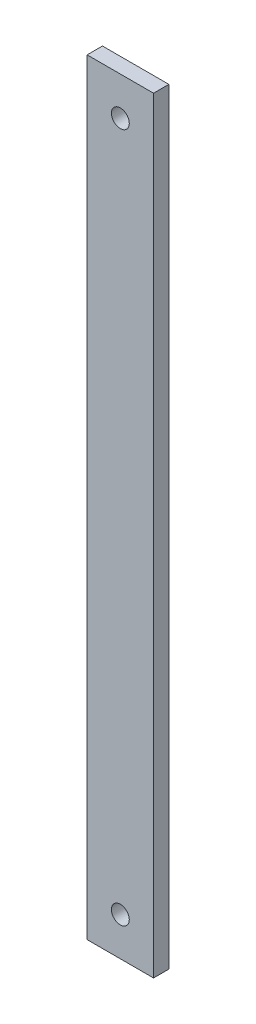
ISO-10303-21;
HEADER;
FILE_DESCRIPTION(('STEP AP214'),'2;1');
FILE_NAME('part.step','',(''),(''),'','','');
FILE_SCHEMA(('AUTOMOTIVE_DESIGN { 1 0 10303 214 1 1 1 1 }'));
ENDSEC;
DATA;
#1=APPLICATION_CONTEXT('core data for automotive mechanical design processes');
#2=APPLICATION_PROTOCOL_DEFINITION('international standard','automotive_design',2000,#1);
#3=PRODUCT_CONTEXT('',#1,'mechanical');
#4=PRODUCT('Part','Part','',(#3));
#5=PRODUCT_RELATED_PRODUCT_CATEGORY('part','',(#4));
#6=PRODUCT_DEFINITION_FORMATION('','',#4);
#7=PRODUCT_DEFINITION_CONTEXT('part definition',#1,'design');
#8=PRODUCT_DEFINITION('design','',#6,#7);
#9=PRODUCT_DEFINITION_SHAPE('','',#8);
#10=(LENGTH_UNIT() NAMED_UNIT(*) SI_UNIT(.MILLI.,.METRE.));
#11=(NAMED_UNIT(*) PLANE_ANGLE_UNIT() SI_UNIT($,.RADIAN.));
#12=(NAMED_UNIT(*) SI_UNIT($,.STERADIAN.) SOLID_ANGLE_UNIT());
#13=UNCERTAINTY_MEASURE_WITH_UNIT(LENGTH_MEASURE(1.E-05),#10,'distance_accuracy_value','');
#14=(GEOMETRIC_REPRESENTATION_CONTEXT(3) GLOBAL_UNCERTAINTY_ASSIGNED_CONTEXT((#13)) GLOBAL_UNIT_ASSIGNED_CONTEXT((#10,
#11,#12)) REPRESENTATION_CONTEXT('',''));
#15=CARTESIAN_POINT('',(0.,0.,0.));
#16=DIRECTION('',(0.,0.,1.));
#17=DIRECTION('',(1.,0.,0.));
#18=AXIS2_PLACEMENT_3D('',#15,#16,#17);
#19=CARTESIAN_POINT('',(0.,0.,3.));
#20=DIRECTION('',(0.,0.,-1.));
#21=DIRECTION('',(-1.,0.,0.));
#22=AXIS2_PLACEMENT_3D('',#19,#20,#21);
#23=PLANE('',#22);
#24=DIRECTION('',(0.,1.,0.));
#25=VECTOR('',#24,1.);
#26=CARTESIAN_POINT('',(6.5,-75.,3.));
#27=LINE('',#26,#25);
#28=CARTESIAN_POINT('',(6.5,-75.,3.));
#29=VERTEX_POINT('',#28);
#30=CARTESIAN_POINT('',(6.5,75.,3.));
#31=VERTEX_POINT('',#30);
#32=EDGE_CURVE('E86',#29,#31,#27,.T.);
#33=ORIENTED_EDGE('',*,*,#32,.T.);
#34=DIRECTION('',(-1.,0.,0.));
#35=VECTOR('',#34,1.);
#36=CARTESIAN_POINT('',(-6.5,75.,3.));
#37=LINE('',#36,#35);
#38=CARTESIAN_POINT('',(-6.5,75.,3.));
#39=VERTEX_POINT('',#38);
#40=EDGE_CURVE('E81',#31,#39,#37,.T.);
#41=ORIENTED_EDGE('',*,*,#40,.T.);
#42=DIRECTION('',(0.,-1.,0.));
#43=VECTOR('',#42,1.);
#44=CARTESIAN_POINT('',(-6.5,-75.,3.));
#45=LINE('',#44,#43);
#46=CARTESIAN_POINT('',(-6.5,-75.,3.));
#47=VERTEX_POINT('',#46);
#48=EDGE_CURVE('E84',#39,#47,#45,.T.);
#49=ORIENTED_EDGE('',*,*,#48,.T.);
#50=DIRECTION('',(1.,0.,0.));
#51=VECTOR('',#50,1.);
#52=CARTESIAN_POINT('',(-6.5,-75.,3.));
#53=LINE('',#52,#51);
#54=EDGE_CURVE('E51',#47,#29,#53,.T.);
#55=ORIENTED_EDGE('',*,*,#54,.T.);
#56=EDGE_LOOP('',(#33,#41,#49,#55));
#57=FACE_BOUND('',#56,.T.);
#58=CARTESIAN_POINT('',(0.,67.5,3.));
#59=DIRECTION('',(0.,0.,1.));
#60=DIRECTION('',(1.,0.,0.));
#61=AXIS2_PLACEMENT_3D('',#58,#59,#60);
#62=CIRCLE('',#61,1.75);
#63=CARTESIAN_POINT('',(1.75000000000002,67.5,3.));
#64=VERTEX_POINT('',#63);
#65=EDGE_CURVE('E101',#64,#64,#62,.T.);
#66=ORIENTED_EDGE('',*,*,#65,.F.);
#67=EDGE_LOOP('',(#66));
#68=FACE_BOUND('',#67,.T.);
#69=CARTESIAN_POINT('',(0.,-67.5,3.));
#70=DIRECTION('',(0.,0.,1.));
#71=DIRECTION('',(1.,0.,0.));
#72=AXIS2_PLACEMENT_3D('',#69,#70,#71);
#73=CIRCLE('',#72,1.75);
#74=CARTESIAN_POINT('',(1.75,-67.5,3.));
#75=VERTEX_POINT('',#74);
#76=EDGE_CURVE('E116',#75,#75,#73,.T.);
#77=ORIENTED_EDGE('',*,*,#76,.F.);
#78=EDGE_LOOP('',(#77));
#79=FACE_BOUND('',#78,.T.);
#80=ADVANCED_FACE('F34',(#57,#68,#79),#23,.F.);
#81=CARTESIAN_POINT('',(0.,0.,0.));
#82=DIRECTION('',(0.,0.,-1.));
#83=DIRECTION('',(-1.,0.,0.));
#84=AXIS2_PLACEMENT_3D('',#81,#82,#83);
#85=PLANE('',#84);
#86=CARTESIAN_POINT('',(0.,67.5,0.));
#87=DIRECTION('',(0.,0.,1.));
#88=DIRECTION('',(1.,0.,0.));
#89=AXIS2_PLACEMENT_3D('',#86,#87,#88);
#90=CIRCLE('',#89,1.75);
#91=CARTESIAN_POINT('',(1.75000000000002,67.5,0.));
#92=VERTEX_POINT('',#91);
#93=EDGE_CURVE('E113',#92,#92,#90,.T.);
#94=ORIENTED_EDGE('',*,*,#93,.T.);
#95=EDGE_LOOP('',(#94));
#96=FACE_BOUND('',#95,.T.);
#97=DIRECTION('',(0.,1.,0.));
#98=VECTOR('',#97,1.);
#99=CARTESIAN_POINT('',(6.5,-75.,0.));
#100=LINE('',#99,#98);
#101=CARTESIAN_POINT('',(6.5,-75.,0.));
#102=VERTEX_POINT('',#101);
#103=CARTESIAN_POINT('',(6.5,75.,0.));
#104=VERTEX_POINT('',#103);
#105=EDGE_CURVE('E98',#102,#104,#100,.T.);
#106=ORIENTED_EDGE('',*,*,#105,.F.);
#107=DIRECTION('',(1.,0.,0.));
#108=VECTOR('',#107,1.);
#109=CARTESIAN_POINT('',(-6.5,-75.,0.));
#110=LINE('',#109,#108);
#111=CARTESIAN_POINT('',(-6.5,-75.,0.));
#112=VERTEX_POINT('',#111);
#113=EDGE_CURVE('E74',#112,#102,#110,.T.);
#114=ORIENTED_EDGE('',*,*,#113,.F.);
#115=DIRECTION('',(0.,-1.,0.));
#116=VECTOR('',#115,1.);
#117=CARTESIAN_POINT('',(-6.5,-75.,0.));
#118=LINE('',#117,#116);
#119=CARTESIAN_POINT('',(-6.5,75.,0.));
#120=VERTEX_POINT('',#119);
#121=EDGE_CURVE('E68',#120,#112,#118,.T.);
#122=ORIENTED_EDGE('',*,*,#121,.F.);
#123=DIRECTION('',(-1.,0.,0.));
#124=VECTOR('',#123,1.);
#125=CARTESIAN_POINT('',(-6.5,75.,0.));
#126=LINE('',#125,#124);
#127=EDGE_CURVE('E90',#104,#120,#126,.T.);
#128=ORIENTED_EDGE('',*,*,#127,.F.);
#129=EDGE_LOOP('',(#106,#114,#122,#128));
#130=FACE_BOUND('',#129,.T.);
#131=CARTESIAN_POINT('',(0.,-67.5,0.));
#132=DIRECTION('',(0.,0.,1.));
#133=DIRECTION('',(1.,0.,0.));
#134=AXIS2_PLACEMENT_3D('',#131,#132,#133);
#135=CIRCLE('',#134,1.75);
#136=CARTESIAN_POINT('',(1.75,-67.5,0.));
#137=VERTEX_POINT('',#136);
#138=EDGE_CURVE('E119',#137,#137,#135,.T.);
#139=ORIENTED_EDGE('',*,*,#138,.T.);
#140=EDGE_LOOP('',(#139));
#141=FACE_BOUND('',#140,.T.);
#142=ADVANCED_FACE('F109',(#96,#130,#141),#85,.T.);
#143=CARTESIAN_POINT('',(6.5,-75.,3.));
#144=DIRECTION('',(-1.,0.,0.));
#145=DIRECTION('',(0.,0.,1.));
#146=AXIS2_PLACEMENT_3D('',#143,#144,#145);
#147=PLANE('',#146);
#148=ORIENTED_EDGE('',*,*,#105,.T.);
#149=DIRECTION('',(0.,0.,-1.));
#150=VECTOR('',#149,1.);
#151=CARTESIAN_POINT('',(6.5,75.,3.));
#152=LINE('',#151,#150);
#153=EDGE_CURVE('E11',#31,#104,#152,.T.);
#154=ORIENTED_EDGE('',*,*,#153,.F.);
#155=ORIENTED_EDGE('',*,*,#32,.F.);
#156=DIRECTION('',(0.,0.,-1.));
#157=VECTOR('',#156,1.);
#158=CARTESIAN_POINT('',(6.5,-75.,3.));
#159=LINE('',#158,#157);
#160=EDGE_CURVE('E94',#29,#102,#159,.T.);
#161=ORIENTED_EDGE('',*,*,#160,.T.);
#162=EDGE_LOOP('',(#148,#154,#155,#161));
#163=FACE_BOUND('',#162,.T.);
#164=ADVANCED_FACE('F36',(#163),#147,.F.);
#165=CARTESIAN_POINT('',(-6.5,75.,3.));
#166=DIRECTION('',(0.,-1.,0.));
#167=DIRECTION('',(0.,0.,-1.));
#168=AXIS2_PLACEMENT_3D('',#165,#166,#167);
#169=PLANE('',#168);
#170=ORIENTED_EDGE('',*,*,#127,.T.);
#171=DIRECTION('',(0.,0.,-1.));
#172=VECTOR('',#171,1.);
#173=CARTESIAN_POINT('',(-6.5,75.,3.));
#174=LINE('',#173,#172);
#175=EDGE_CURVE('E43',#39,#120,#174,.T.);
#176=ORIENTED_EDGE('',*,*,#175,.F.);
#177=ORIENTED_EDGE('',*,*,#40,.F.);
#178=ORIENTED_EDGE('',*,*,#153,.T.);
#179=EDGE_LOOP('',(#170,#176,#177,#178));
#180=FACE_BOUND('',#179,.T.);
#181=ADVANCED_FACE('F89',(#180),#169,.F.);
#182=CARTESIAN_POINT('',(-6.5,-75.,3.));
#183=DIRECTION('',(1.,0.,0.));
#184=DIRECTION('',(0.,0.,-1.));
#185=AXIS2_PLACEMENT_3D('',#182,#183,#184);
#186=PLANE('',#185);
#187=ORIENTED_EDGE('',*,*,#121,.T.);
#188=DIRECTION('',(0.,0.,-1.));
#189=VECTOR('',#188,1.);
#190=CARTESIAN_POINT('',(-6.5,-75.,3.));
#191=LINE('',#190,#189);
#192=EDGE_CURVE('E91',#47,#112,#191,.T.);
#193=ORIENTED_EDGE('',*,*,#192,.F.);
#194=ORIENTED_EDGE('',*,*,#48,.F.);
#195=ORIENTED_EDGE('',*,*,#175,.T.);
#196=EDGE_LOOP('',(#187,#193,#194,#195));
#197=FACE_BOUND('',#196,.T.);
#198=ADVANCED_FACE('F92',(#197),#186,.F.);
#199=CARTESIAN_POINT('',(-6.5,-75.,3.));
#200=DIRECTION('',(0.,1.,0.));
#201=DIRECTION('',(0.,0.,1.));
#202=AXIS2_PLACEMENT_3D('',#199,#200,#201);
#203=PLANE('',#202);
#204=ORIENTED_EDGE('',*,*,#113,.T.);
#205=ORIENTED_EDGE('',*,*,#160,.F.);
#206=ORIENTED_EDGE('',*,*,#54,.F.);
#207=ORIENTED_EDGE('',*,*,#192,.T.);
#208=EDGE_LOOP('',(#204,#205,#206,#207));
#209=FACE_BOUND('',#208,.T.);
#210=ADVANCED_FACE('F106',(#209),#203,.F.);
#211=CARTESIAN_POINT('',(0.,67.5,3.));
#212=DIRECTION('',(0.,0.,-1.));
#213=DIRECTION('',(-1.,0.,0.));
#214=AXIS2_PLACEMENT_3D('',#211,#212,#213);
#215=CYLINDRICAL_SURFACE('',#214,1.75);
#216=ORIENTED_EDGE('',*,*,#65,.T.);
#217=EDGE_LOOP('',(#216));
#218=FACE_BOUND('',#217,.T.);
#219=ORIENTED_EDGE('',*,*,#93,.F.);
#220=EDGE_LOOP('',(#219));
#221=FACE_BOUND('',#220,.T.);
#222=ADVANCED_FACE('F136',(#218,#221),#215,.F.);
#223=CARTESIAN_POINT('',(0.,-67.5,3.));
#224=DIRECTION('',(0.,0.,-1.));
#225=DIRECTION('',(-1.,0.,0.));
#226=AXIS2_PLACEMENT_3D('',#223,#224,#225);
#227=CYLINDRICAL_SURFACE('',#226,1.75);
#228=ORIENTED_EDGE('',*,*,#76,.T.);
#229=EDGE_LOOP('',(#228));
#230=FACE_BOUND('',#229,.T.);
#231=ORIENTED_EDGE('',*,*,#138,.F.);
#232=EDGE_LOOP('',(#231));
#233=FACE_BOUND('',#232,.T.);
#234=ADVANCED_FACE('F125',(#230,#233),#227,.F.);
#235=CLOSED_SHELL('',(#80,#142,#164,#181,#198,#210,#222,#234));
#236=MANIFOLD_SOLID_BREP('B2',#235);
#237=ADVANCED_BREP_SHAPE_REPRESENTATION('',(#18,#236),#14);
#238=SHAPE_DEFINITION_REPRESENTATION(#9,#237);
ENDSEC;
END-ISO-10303-21;
